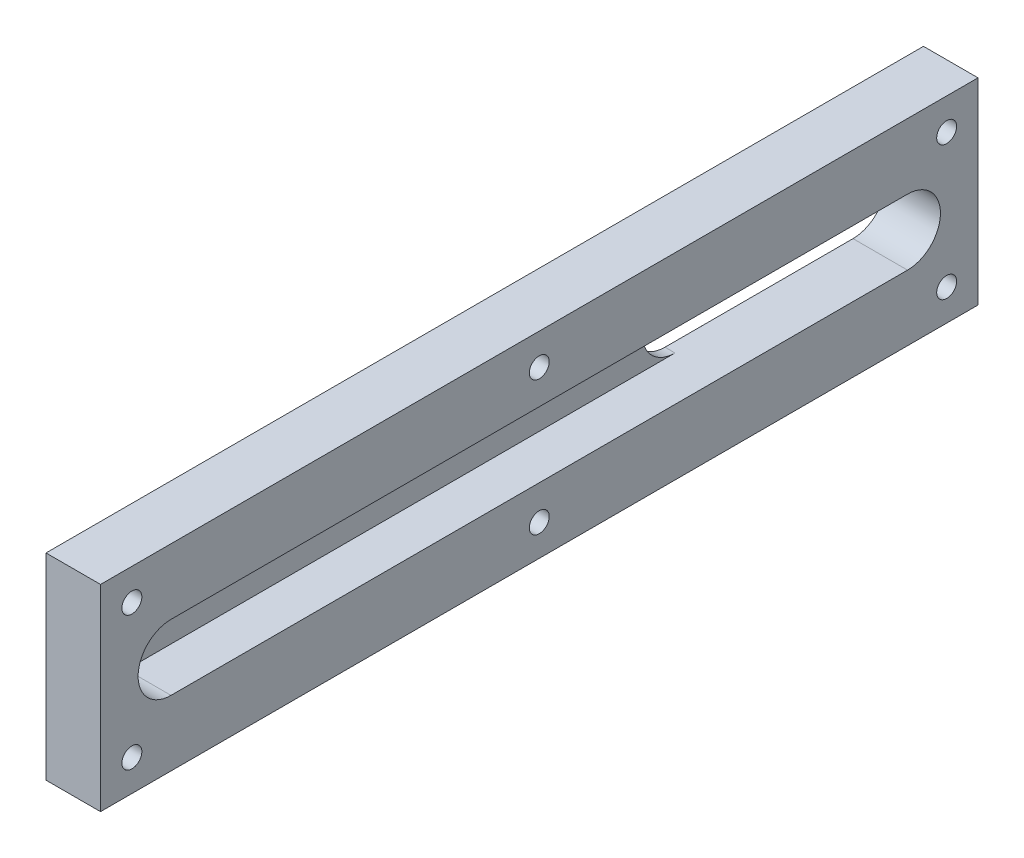
ISO-10303-21;
HEADER;
FILE_DESCRIPTION(('STEP AP214'),'2;1');
FILE_NAME('part.step','',(''),(''),'','','');
FILE_SCHEMA(('AUTOMOTIVE_DESIGN { 1 0 10303 214 1 1 1 1 }'));
ENDSEC;
DATA;
#1=APPLICATION_CONTEXT('core data for automotive mechanical design processes');
#2=APPLICATION_PROTOCOL_DEFINITION('international standard','automotive_design',2000,#1);
#3=PRODUCT_CONTEXT('',#1,'mechanical');
#4=PRODUCT('Part','Part','',(#3));
#5=PRODUCT_RELATED_PRODUCT_CATEGORY('part','',(#4));
#6=PRODUCT_DEFINITION_FORMATION('','',#4);
#7=PRODUCT_DEFINITION_CONTEXT('part definition',#1,'design');
#8=PRODUCT_DEFINITION('design','',#6,#7);
#9=PRODUCT_DEFINITION_SHAPE('','',#8);
#10=(LENGTH_UNIT() NAMED_UNIT(*) SI_UNIT(.MILLI.,.METRE.));
#11=(NAMED_UNIT(*) PLANE_ANGLE_UNIT() SI_UNIT($,.RADIAN.));
#12=(NAMED_UNIT(*) SI_UNIT($,.STERADIAN.) SOLID_ANGLE_UNIT());
#13=UNCERTAINTY_MEASURE_WITH_UNIT(LENGTH_MEASURE(1.E-05),#10,'distance_accuracy_value','');
#14=(GEOMETRIC_REPRESENTATION_CONTEXT(3) GLOBAL_UNCERTAINTY_ASSIGNED_CONTEXT((#13)) GLOBAL_UNIT_ASSIGNED_CONTEXT((#10,
#11,#12)) REPRESENTATION_CONTEXT('',''));
#15=CARTESIAN_POINT('',(0.,0.,0.));
#16=DIRECTION('',(0.,0.,1.));
#17=DIRECTION('',(1.,0.,0.));
#18=AXIS2_PLACEMENT_3D('',#15,#16,#17);
#19=CARTESIAN_POINT('',(11.049,-6.66750000000003,74.621306688));
#20=DIRECTION('',(0.,1.,0.));
#21=DIRECTION('',(0.,0.,1.));
#22=AXIS2_PLACEMENT_3D('',#19,#20,#21);
#23=PLANE('',#22);
#24=DIRECTION('',(0.,0.,-1.));
#25=VECTOR('',#24,1.);
#26=CARTESIAN_POINT('',(0.,-6.66750000000003,74.621306688));
#27=LINE('',#26,#25);
#28=CARTESIAN_POINT('',(0.,-6.6675,-36.521306688));
#29=VERTEX_POINT('',#28);
#30=CARTESIAN_POINT('',(0.,-6.6675,-74.621306688));
#31=VERTEX_POINT('',#30);
#32=EDGE_CURVE('E168',#29,#31,#27,.T.);
#33=ORIENTED_EDGE('',*,*,#32,.F.);
#34=DIRECTION('',(-1.,0.,0.));
#35=VECTOR('',#34,1.);
#36=CARTESIAN_POINT('',(2.032,-6.6675,-36.521306688));
#37=LINE('',#36,#35);
#38=CARTESIAN_POINT('',(2.032,-6.6675,-36.521306688));
#39=VERTEX_POINT('',#38);
#40=EDGE_CURVE('E159',#39,#29,#37,.T.);
#41=ORIENTED_EDGE('',*,*,#40,.F.);
#42=DIRECTION('',(0.,0.,1.));
#43=VECTOR('',#42,1.);
#44=CARTESIAN_POINT('',(2.032,-6.6675,-36.521306688));
#45=LINE('',#44,#43);
#46=CARTESIAN_POINT('',(2.032,-6.66750000000003,74.621306688));
#47=VERTEX_POINT('',#46);
#48=EDGE_CURVE('E144',#39,#47,#45,.T.);
#49=ORIENTED_EDGE('',*,*,#48,.T.);
#50=DIRECTION('',(-1.,0.,0.));
#51=VECTOR('',#50,1.);
#52=CARTESIAN_POINT('',(11.049,-6.66750000000003,74.621306688));
#53=LINE('',#52,#51);
#54=CARTESIAN_POINT('',(11.049,-6.66750000000003,74.621306688));
#55=VERTEX_POINT('',#54);
#56=EDGE_CURVE('E251',#55,#47,#53,.T.);
#57=ORIENTED_EDGE('',*,*,#56,.F.);
#58=DIRECTION('',(0.,0.,-1.));
#59=VECTOR('',#58,1.);
#60=CARTESIAN_POINT('',(11.049,-6.66750000000003,74.621306688));
#61=LINE('',#60,#59);
#62=CARTESIAN_POINT('',(11.049,-6.6675,-74.621306688));
#63=VERTEX_POINT('',#62);
#64=EDGE_CURVE('E226',#55,#63,#61,.T.);
#65=ORIENTED_EDGE('',*,*,#64,.T.);
#66=DIRECTION('',(-1.,0.,0.));
#67=VECTOR('',#66,1.);
#68=CARTESIAN_POINT('',(11.049,-6.6675,-74.621306688));
#69=LINE('',#68,#67);
#70=EDGE_CURVE('E248',#63,#31,#69,.T.);
#71=ORIENTED_EDGE('',*,*,#70,.T.);
#72=EDGE_LOOP('',(#33,#41,#49,#57,#65,#71));
#73=FACE_BOUND('',#72,.T.);
#74=ADVANCED_FACE('F47',(#73),#23,.T.);
#75=CARTESIAN_POINT('',(11.049,0.,0.));
#76=DIRECTION('',(1.,0.,0.));
#77=DIRECTION('',(0.,0.,-1.));
#78=AXIS2_PLACEMENT_3D('',#75,#76,#77);
#79=PLANE('',#78);
#80=CARTESIAN_POINT('',(11.049,13.589,82.55));
#81=DIRECTION('',(1.,0.,0.));
#82=DIRECTION('',(0.,0.,-1.));
#83=AXIS2_PLACEMENT_3D('',#80,#81,#82);
#84=CIRCLE('',#83,2.0193);
#85=CARTESIAN_POINT('',(11.049,13.589,80.5307));
#86=VERTEX_POINT('',#85);
#87=EDGE_CURVE('E174',#86,#86,#84,.T.);
#88=ORIENTED_EDGE('',*,*,#87,.F.);
#89=EDGE_LOOP('',(#88));
#90=FACE_BOUND('',#89,.T.);
#91=CARTESIAN_POINT('',(11.049,-13.589,82.55));
#92=DIRECTION('',(1.,0.,0.));
#93=DIRECTION('',(0.,0.,-1.));
#94=AXIS2_PLACEMENT_3D('',#91,#92,#93);
#95=CIRCLE('',#94,2.0193);
#96=CARTESIAN_POINT('',(11.049,-13.589,80.5307));
#97=VERTEX_POINT('',#96);
#98=EDGE_CURVE('E187',#97,#97,#95,.T.);
#99=ORIENTED_EDGE('',*,*,#98,.F.);
#100=EDGE_LOOP('',(#99));
#101=FACE_BOUND('',#100,.T.);
#102=CARTESIAN_POINT('',(11.049,-13.589,0.));
#103=DIRECTION('',(1.,0.,0.));
#104=DIRECTION('',(0.,0.,-1.));
#105=AXIS2_PLACEMENT_3D('',#102,#103,#104);
#106=CIRCLE('',#105,2.0193);
#107=CARTESIAN_POINT('',(11.049,-13.589,-2.0193));
#108=VERTEX_POINT('',#107);
#109=EDGE_CURVE('E193',#108,#108,#106,.T.);
#110=ORIENTED_EDGE('',*,*,#109,.F.);
#111=EDGE_LOOP('',(#110));
#112=FACE_BOUND('',#111,.T.);
#113=CARTESIAN_POINT('',(11.049,-13.589,-82.55));
#114=DIRECTION('',(1.,0.,0.));
#115=DIRECTION('',(0.,0.,-1.));
#116=AXIS2_PLACEMENT_3D('',#113,#114,#115);
#117=CIRCLE('',#116,2.0193);
#118=CARTESIAN_POINT('',(11.049,-13.589,-84.5693));
#119=VERTEX_POINT('',#118);
#120=EDGE_CURVE('E201',#119,#119,#117,.T.);
#121=ORIENTED_EDGE('',*,*,#120,.F.);
#122=EDGE_LOOP('',(#121));
#123=FACE_BOUND('',#122,.T.);
#124=CARTESIAN_POINT('',(11.049,13.589,-82.55));
#125=DIRECTION('',(1.,0.,0.));
#126=DIRECTION('',(0.,0.,-1.));
#127=AXIS2_PLACEMENT_3D('',#124,#125,#126);
#128=CIRCLE('',#127,2.0193);
#129=CARTESIAN_POINT('',(11.049,13.589,-84.5693));
#130=VERTEX_POINT('',#129);
#131=EDGE_CURVE('E208',#130,#130,#128,.T.);
#132=ORIENTED_EDGE('',*,*,#131,.F.);
#133=EDGE_LOOP('',(#132));
#134=FACE_BOUND('',#133,.T.);
#135=CARTESIAN_POINT('',(11.049,13.589,0.));
#136=DIRECTION('',(1.,0.,0.));
#137=DIRECTION('',(0.,0.,-1.));
#138=AXIS2_PLACEMENT_3D('',#135,#136,#137);
#139=CIRCLE('',#138,2.0193);
#140=CARTESIAN_POINT('',(11.049,13.589,-2.0193));
#141=VERTEX_POINT('',#140);
#142=EDGE_CURVE('E215',#141,#141,#139,.T.);
#143=ORIENTED_EDGE('',*,*,#142,.F.);
#144=EDGE_LOOP('',(#143));
#145=FACE_BOUND('',#144,.T.);
#146=DIRECTION('',(0.,-1.,0.));
#147=VECTOR('',#146,1.);
#148=CARTESIAN_POINT('',(11.049,-19.939,88.9));
#149=LINE('',#148,#147);
#150=CARTESIAN_POINT('',(11.049,19.939,88.9));
#151=VERTEX_POINT('',#150);
#152=CARTESIAN_POINT('',(11.049,-19.939,88.9));
#153=VERTEX_POINT('',#152);
#154=EDGE_CURVE('E255',#151,#153,#149,.T.);
#155=ORIENTED_EDGE('',*,*,#154,.T.);
#156=DIRECTION('',(0.,0.,-1.));
#157=VECTOR('',#156,1.);
#158=CARTESIAN_POINT('',(11.049,-19.939,-88.9));
#159=LINE('',#158,#157);
#160=CARTESIAN_POINT('',(11.049,-19.939,-88.9));
#161=VERTEX_POINT('',#160);
#162=EDGE_CURVE('E106',#153,#161,#159,.T.);
#163=ORIENTED_EDGE('',*,*,#162,.T.);
#164=DIRECTION('',(0.,1.,0.));
#165=VECTOR('',#164,1.);
#166=CARTESIAN_POINT('',(11.049,-19.939,-88.9));
#167=LINE('',#166,#165);
#168=CARTESIAN_POINT('',(11.049,19.939,-88.9));
#169=VERTEX_POINT('',#168);
#170=EDGE_CURVE('E260',#161,#169,#167,.T.);
#171=ORIENTED_EDGE('',*,*,#170,.T.);
#172=DIRECTION('',(0.,0.,1.));
#173=VECTOR('',#172,1.);
#174=CARTESIAN_POINT('',(11.049,19.939,-88.9));
#175=LINE('',#174,#173);
#176=EDGE_CURVE('E77',#169,#151,#175,.T.);
#177=ORIENTED_EDGE('',*,*,#176,.T.);
#178=EDGE_LOOP('',(#155,#163,#171,#177));
#179=FACE_BOUND('',#178,.T.);
#180=ORIENTED_EDGE('',*,*,#64,.F.);
#181=CARTESIAN_POINT('',(11.049,0.,74.621306688));
#182=DIRECTION('',(1.,0.,0.));
#183=DIRECTION('',(0.,0.,-1.));
#184=AXIS2_PLACEMENT_3D('',#181,#182,#183);
#185=CIRCLE('',#184,6.66750000000003);
#186=CARTESIAN_POINT('',(11.049,6.66750000000003,74.621306688));
#187=VERTEX_POINT('',#186);
#188=EDGE_CURVE('E223',#187,#55,#185,.T.);
#189=ORIENTED_EDGE('',*,*,#188,.F.);
#190=DIRECTION('',(0.,0.,1.));
#191=VECTOR('',#190,1.);
#192=CARTESIAN_POINT('',(11.049,6.66750000000003,74.621306688));
#193=LINE('',#192,#191);
#194=CARTESIAN_POINT('',(11.049,6.66750000000006,-74.621306688));
#195=VERTEX_POINT('',#194);
#196=EDGE_CURVE('E233',#195,#187,#193,.T.);
#197=ORIENTED_EDGE('',*,*,#196,.F.);
#198=CARTESIAN_POINT('',(11.049,0.,-74.621306688));
#199=DIRECTION('',(1.,0.,0.));
#200=DIRECTION('',(0.,0.,-1.));
#201=AXIS2_PLACEMENT_3D('',#198,#199,#200);
#202=CIRCLE('',#201,6.66750000000003);
#203=EDGE_CURVE('E230',#63,#195,#202,.T.);
#204=ORIENTED_EDGE('',*,*,#203,.F.);
#205=EDGE_LOOP('',(#180,#189,#197,#204));
#206=FACE_BOUND('',#205,.T.);
#207=ADVANCED_FACE('F307',(#90,#101,#112,#123,#134,#145,#179,#206),#79,.T.);
#208=CARTESIAN_POINT('',(0.,0.,0.));
#209=DIRECTION('',(1.,0.,0.));
#210=DIRECTION('',(0.,0.,-1.));
#211=AXIS2_PLACEMENT_3D('',#208,#209,#210);
#212=PLANE('',#211);
#213=CARTESIAN_POINT('',(0.,0.,-36.521306688));
#214=DIRECTION('',(1.,0.,0.));
#215=DIRECTION('',(0.,0.,-1.));
#216=AXIS2_PLACEMENT_3D('',#213,#214,#215);
#217=CIRCLE('',#216,6.66750000000003);
#218=CARTESIAN_POINT('',(0.,6.66750000000005,-36.521306688));
#219=VERTEX_POINT('',#218);
#220=EDGE_CURVE('E164',#219,#29,#217,.T.);
#221=ORIENTED_EDGE('',*,*,#220,.T.);
#222=ORIENTED_EDGE('',*,*,#32,.T.);
#223=CARTESIAN_POINT('',(0.,0.,-74.621306688));
#224=DIRECTION('',(1.,0.,0.));
#225=DIRECTION('',(0.,0.,-1.));
#226=AXIS2_PLACEMENT_3D('',#223,#224,#225);
#227=CIRCLE('',#226,6.66750000000003);
#228=CARTESIAN_POINT('',(0.,6.66750000000006,-74.621306688));
#229=VERTEX_POINT('',#228);
#230=EDGE_CURVE('E238',#31,#229,#227,.T.);
#231=ORIENTED_EDGE('',*,*,#230,.T.);
#232=DIRECTION('',(0.,0.,1.));
#233=VECTOR('',#232,1.);
#234=CARTESIAN_POINT('',(0.,6.66750000000003,74.621306688));
#235=LINE('',#234,#233);
#236=EDGE_CURVE('E227',#229,#219,#235,.T.);
#237=ORIENTED_EDGE('',*,*,#236,.T.);
#238=EDGE_LOOP('',(#221,#222,#231,#237));
#239=FACE_BOUND('',#238,.T.);
#240=CARTESIAN_POINT('',(0.,13.589,82.55));
#241=DIRECTION('',(1.,0.,0.));
#242=DIRECTION('',(0.,0.,-1.));
#243=AXIS2_PLACEMENT_3D('',#240,#241,#242);
#244=CIRCLE('',#243,2.0193);
#245=CARTESIAN_POINT('',(0.,13.589,80.5307));
#246=VERTEX_POINT('',#245);
#247=EDGE_CURVE('E183',#246,#246,#244,.T.);
#248=ORIENTED_EDGE('',*,*,#247,.T.);
#249=EDGE_LOOP('',(#248));
#250=FACE_BOUND('',#249,.T.);
#251=CARTESIAN_POINT('',(0.,-13.589,82.55));
#252=DIRECTION('',(1.,0.,0.));
#253=DIRECTION('',(0.,0.,-1.));
#254=AXIS2_PLACEMENT_3D('',#251,#252,#253);
#255=CIRCLE('',#254,2.0193);
#256=CARTESIAN_POINT('',(0.,-13.589,80.5307));
#257=VERTEX_POINT('',#256);
#258=EDGE_CURVE('E190',#257,#257,#255,.T.);
#259=ORIENTED_EDGE('',*,*,#258,.T.);
#260=EDGE_LOOP('',(#259));
#261=FACE_BOUND('',#260,.T.);
#262=CARTESIAN_POINT('',(0.,-13.589,0.));
#263=DIRECTION('',(1.,0.,0.));
#264=DIRECTION('',(0.,0.,-1.));
#265=AXIS2_PLACEMENT_3D('',#262,#263,#264);
#266=CIRCLE('',#265,2.0193);
#267=CARTESIAN_POINT('',(0.,-13.589,-2.0193));
#268=VERTEX_POINT('',#267);
#269=EDGE_CURVE('E197',#268,#268,#266,.T.);
#270=ORIENTED_EDGE('',*,*,#269,.T.);
#271=EDGE_LOOP('',(#270));
#272=FACE_BOUND('',#271,.T.);
#273=CARTESIAN_POINT('',(0.,-13.589,-82.55));
#274=DIRECTION('',(1.,0.,0.));
#275=DIRECTION('',(0.,0.,-1.));
#276=AXIS2_PLACEMENT_3D('',#273,#274,#275);
#277=CIRCLE('',#276,2.0193);
#278=CARTESIAN_POINT('',(0.,-13.589,-84.5693));
#279=VERTEX_POINT('',#278);
#280=EDGE_CURVE('E205',#279,#279,#277,.T.);
#281=ORIENTED_EDGE('',*,*,#280,.T.);
#282=EDGE_LOOP('',(#281));
#283=FACE_BOUND('',#282,.T.);
#284=CARTESIAN_POINT('',(0.,13.589,-82.55));
#285=DIRECTION('',(1.,0.,0.));
#286=DIRECTION('',(0.,0.,-1.));
#287=AXIS2_PLACEMENT_3D('',#284,#285,#286);
#288=CIRCLE('',#287,2.0193);
#289=CARTESIAN_POINT('',(0.,13.589,-84.5693));
#290=VERTEX_POINT('',#289);
#291=EDGE_CURVE('E212',#290,#290,#288,.T.);
#292=ORIENTED_EDGE('',*,*,#291,.T.);
#293=EDGE_LOOP('',(#292));
#294=FACE_BOUND('',#293,.T.);
#295=CARTESIAN_POINT('',(0.,13.589,0.));
#296=DIRECTION('',(1.,0.,0.));
#297=DIRECTION('',(0.,0.,-1.));
#298=AXIS2_PLACEMENT_3D('',#295,#296,#297);
#299=CIRCLE('',#298,2.0193);
#300=CARTESIAN_POINT('',(0.,13.589,-2.0193));
#301=VERTEX_POINT('',#300);
#302=EDGE_CURVE('E219',#301,#301,#299,.T.);
#303=ORIENTED_EDGE('',*,*,#302,.T.);
#304=EDGE_LOOP('',(#303));
#305=FACE_BOUND('',#304,.T.);
#306=DIRECTION('',(0.,-1.,0.));
#307=VECTOR('',#306,1.);
#308=CARTESIAN_POINT('',(0.,-19.939,88.9));
#309=LINE('',#308,#307);
#310=CARTESIAN_POINT('',(0.,19.939,88.9));
#311=VERTEX_POINT('',#310);
#312=CARTESIAN_POINT('',(0.,-19.939,88.9));
#313=VERTEX_POINT('',#312);
#314=EDGE_CURVE('E254',#311,#313,#309,.T.);
#315=ORIENTED_EDGE('',*,*,#314,.F.);
#316=DIRECTION('',(0.,0.,1.));
#317=VECTOR('',#316,1.);
#318=CARTESIAN_POINT('',(0.,19.939,-88.9));
#319=LINE('',#318,#317);
#320=CARTESIAN_POINT('',(0.,19.939,-88.9));
#321=VERTEX_POINT('',#320);
#322=EDGE_CURVE('E99',#321,#311,#319,.T.);
#323=ORIENTED_EDGE('',*,*,#322,.F.);
#324=DIRECTION('',(0.,1.,0.));
#325=VECTOR('',#324,1.);
#326=CARTESIAN_POINT('',(0.,-19.939,-88.9));
#327=LINE('',#326,#325);
#328=CARTESIAN_POINT('',(0.,-19.939,-88.9));
#329=VERTEX_POINT('',#328);
#330=EDGE_CURVE('E272',#329,#321,#327,.T.);
#331=ORIENTED_EDGE('',*,*,#330,.F.);
#332=DIRECTION('',(0.,0.,-1.));
#333=VECTOR('',#332,1.);
#334=CARTESIAN_POINT('',(0.,-19.939,-88.9));
#335=LINE('',#334,#333);
#336=EDGE_CURVE('E269',#313,#329,#335,.T.);
#337=ORIENTED_EDGE('',*,*,#336,.F.);
#338=EDGE_LOOP('',(#315,#323,#331,#337));
#339=FACE_BOUND('',#338,.T.);
#340=ADVANCED_FACE('F288',(#239,#250,#261,#272,#283,#294,#305,#339),#212,.F.);
#341=CARTESIAN_POINT('',(11.049,-19.939,88.9));
#342=DIRECTION('',(0.,0.,-1.));
#343=DIRECTION('',(-1.,0.,0.));
#344=AXIS2_PLACEMENT_3D('',#341,#342,#343);
#345=PLANE('',#344);
#346=ORIENTED_EDGE('',*,*,#314,.T.);
#347=DIRECTION('',(-1.,0.,0.));
#348=VECTOR('',#347,1.);
#349=CARTESIAN_POINT('',(11.049,-19.939,88.9));
#350=LINE('',#349,#348);
#351=EDGE_CURVE('E11',#153,#313,#350,.T.);
#352=ORIENTED_EDGE('',*,*,#351,.F.);
#353=ORIENTED_EDGE('',*,*,#154,.F.);
#354=DIRECTION('',(-1.,0.,0.));
#355=VECTOR('',#354,1.);
#356=CARTESIAN_POINT('',(11.049,19.939,88.9));
#357=LINE('',#356,#355);
#358=EDGE_CURVE('E265',#151,#311,#357,.T.);
#359=ORIENTED_EDGE('',*,*,#358,.T.);
#360=EDGE_LOOP('',(#346,#352,#353,#359));
#361=FACE_BOUND('',#360,.T.);
#362=ADVANCED_FACE('F49',(#361),#345,.F.);
#363=CARTESIAN_POINT('',(11.049,-19.939,-88.9));
#364=DIRECTION('',(0.,1.,0.));
#365=DIRECTION('',(0.,0.,1.));
#366=AXIS2_PLACEMENT_3D('',#363,#364,#365);
#367=PLANE('',#366);
#368=ORIENTED_EDGE('',*,*,#336,.T.);
#369=DIRECTION('',(-1.,0.,0.));
#370=VECTOR('',#369,1.);
#371=CARTESIAN_POINT('',(11.049,-19.939,-88.9));
#372=LINE('',#371,#370);
#373=EDGE_CURVE('E55',#161,#329,#372,.T.);
#374=ORIENTED_EDGE('',*,*,#373,.F.);
#375=ORIENTED_EDGE('',*,*,#162,.F.);
#376=ORIENTED_EDGE('',*,*,#351,.T.);
#377=EDGE_LOOP('',(#368,#374,#375,#376));
#378=FACE_BOUND('',#377,.T.);
#379=ADVANCED_FACE('F303',(#378),#367,.F.);
#380=CARTESIAN_POINT('',(11.049,-19.939,-88.9));
#381=DIRECTION('',(0.,0.,1.));
#382=DIRECTION('',(1.,0.,0.));
#383=AXIS2_PLACEMENT_3D('',#380,#381,#382);
#384=PLANE('',#383);
#385=ORIENTED_EDGE('',*,*,#330,.T.);
#386=DIRECTION('',(-1.,0.,0.));
#387=VECTOR('',#386,1.);
#388=CARTESIAN_POINT('',(11.049,19.939,-88.9));
#389=LINE('',#388,#387);
#390=EDGE_CURVE('E278',#169,#321,#389,.T.);
#391=ORIENTED_EDGE('',*,*,#390,.F.);
#392=ORIENTED_EDGE('',*,*,#170,.F.);
#393=ORIENTED_EDGE('',*,*,#373,.T.);
#394=EDGE_LOOP('',(#385,#391,#392,#393));
#395=FACE_BOUND('',#394,.T.);
#396=ADVANCED_FACE('F284',(#395),#384,.F.);
#397=CARTESIAN_POINT('',(11.049,19.939,-88.9));
#398=DIRECTION('',(0.,-1.,0.));
#399=DIRECTION('',(0.,0.,-1.));
#400=AXIS2_PLACEMENT_3D('',#397,#398,#399);
#401=PLANE('',#400);
#402=ORIENTED_EDGE('',*,*,#322,.T.);
#403=ORIENTED_EDGE('',*,*,#358,.F.);
#404=ORIENTED_EDGE('',*,*,#176,.F.);
#405=ORIENTED_EDGE('',*,*,#390,.T.);
#406=EDGE_LOOP('',(#402,#403,#404,#405));
#407=FACE_BOUND('',#406,.T.);
#408=ADVANCED_FACE('F292',(#407),#401,.F.);
#409=CARTESIAN_POINT('',(11.049,0.,74.621306688));
#410=DIRECTION('',(-1.,0.,0.));
#411=DIRECTION('',(0.,0.,1.));
#412=AXIS2_PLACEMENT_3D('',#409,#410,#411);
#413=CYLINDRICAL_SURFACE('',#412,6.66750000000003);
#414=CARTESIAN_POINT('',(2.032,0.,74.621306688));
#415=DIRECTION('',(-1.,0.,0.));
#416=DIRECTION('',(0.,0.,1.));
#417=AXIS2_PLACEMENT_3D('',#414,#415,#416);
#418=CIRCLE('',#417,6.66750000000003);
#419=CARTESIAN_POINT('',(2.032,6.66750000000003,74.621306688));
#420=VERTEX_POINT('',#419);
#421=EDGE_CURVE('E150',#47,#420,#418,.T.);
#422=ORIENTED_EDGE('',*,*,#421,.T.);
#423=DIRECTION('',(-1.,0.,0.));
#424=VECTOR('',#423,1.);
#425=CARTESIAN_POINT('',(11.049,6.66750000000003,74.621306688));
#426=LINE('',#425,#424);
#427=EDGE_CURVE('E236',#187,#420,#426,.T.);
#428=ORIENTED_EDGE('',*,*,#427,.F.);
#429=ORIENTED_EDGE('',*,*,#188,.T.);
#430=ORIENTED_EDGE('',*,*,#56,.T.);
#431=EDGE_LOOP('',(#422,#428,#429,#430));
#432=FACE_BOUND('',#431,.T.);
#433=ADVANCED_FACE('F294',(#432),#413,.F.);
#434=CARTESIAN_POINT('',(11.049,0.,-74.621306688));
#435=DIRECTION('',(-1.,0.,0.));
#436=DIRECTION('',(0.,0.,1.));
#437=AXIS2_PLACEMENT_3D('',#434,#435,#436);
#438=CYLINDRICAL_SURFACE('',#437,6.66750000000003);
#439=ORIENTED_EDGE('',*,*,#230,.F.);
#440=ORIENTED_EDGE('',*,*,#70,.F.);
#441=ORIENTED_EDGE('',*,*,#203,.T.);
#442=DIRECTION('',(-1.,0.,0.));
#443=VECTOR('',#442,1.);
#444=CARTESIAN_POINT('',(11.049,6.66750000000006,-74.621306688));
#445=LINE('',#444,#443);
#446=EDGE_CURVE('E65',#195,#229,#445,.T.);
#447=ORIENTED_EDGE('',*,*,#446,.T.);
#448=EDGE_LOOP('',(#439,#440,#441,#447));
#449=FACE_BOUND('',#448,.T.);
#450=ADVANCED_FACE('F300',(#449),#438,.F.);
#451=CARTESIAN_POINT('',(11.049,6.66750000000003,74.621306688));
#452=DIRECTION('',(0.,-1.,0.));
#453=DIRECTION('',(0.,0.,-1.));
#454=AXIS2_PLACEMENT_3D('',#451,#452,#453);
#455=PLANE('',#454);
#456=DIRECTION('',(-1.,0.,0.));
#457=VECTOR('',#456,1.);
#458=CARTESIAN_POINT('',(2.032,6.66750000000005,-36.521306688));
#459=LINE('',#458,#457);
#460=CARTESIAN_POINT('',(2.032,6.66750000000005,-36.521306688));
#461=VERTEX_POINT('',#460);
#462=EDGE_CURVE('E162',#461,#219,#459,.T.);
#463=ORIENTED_EDGE('',*,*,#462,.T.);
#464=ORIENTED_EDGE('',*,*,#236,.F.);
#465=ORIENTED_EDGE('',*,*,#446,.F.);
#466=ORIENTED_EDGE('',*,*,#196,.T.);
#467=ORIENTED_EDGE('',*,*,#427,.T.);
#468=DIRECTION('',(0.,0.,-1.));
#469=VECTOR('',#468,1.);
#470=CARTESIAN_POINT('',(2.032,6.66750000000003,74.621306688));
#471=LINE('',#470,#469);
#472=EDGE_CURVE('E170',#420,#461,#471,.T.);
#473=ORIENTED_EDGE('',*,*,#472,.T.);
#474=EDGE_LOOP('',(#463,#464,#465,#466,#467,#473));
#475=FACE_BOUND('',#474,.T.);
#476=ADVANCED_FACE('F338',(#475),#455,.T.);
#477=CARTESIAN_POINT('',(11.049,13.589,0.));
#478=DIRECTION('',(1.,0.,0.));
#479=DIRECTION('',(0.,0.,-1.));
#480=AXIS2_PLACEMENT_3D('',#477,#478,#479);
#481=CYLINDRICAL_SURFACE('',#480,2.0193);
#482=ORIENTED_EDGE('',*,*,#302,.F.);
#483=EDGE_LOOP('',(#482));
#484=FACE_BOUND('',#483,.T.);
#485=ORIENTED_EDGE('',*,*,#142,.T.);
#486=EDGE_LOOP('',(#485));
#487=FACE_BOUND('',#486,.T.);
#488=ADVANCED_FACE('F334',(#484,#487),#481,.F.);
#489=CARTESIAN_POINT('',(11.049,13.589,-82.55));
#490=DIRECTION('',(1.,0.,0.));
#491=DIRECTION('',(0.,0.,-1.));
#492=AXIS2_PLACEMENT_3D('',#489,#490,#491);
#493=CYLINDRICAL_SURFACE('',#492,2.0193);
#494=ORIENTED_EDGE('',*,*,#291,.F.);
#495=EDGE_LOOP('',(#494));
#496=FACE_BOUND('',#495,.T.);
#497=ORIENTED_EDGE('',*,*,#131,.T.);
#498=EDGE_LOOP('',(#497));
#499=FACE_BOUND('',#498,.T.);
#500=ADVANCED_FACE('F337',(#496,#499),#493,.F.);
#501=CARTESIAN_POINT('',(11.049,-13.589,-82.55));
#502=DIRECTION('',(1.,0.,0.));
#503=DIRECTION('',(0.,0.,-1.));
#504=AXIS2_PLACEMENT_3D('',#501,#502,#503);
#505=CYLINDRICAL_SURFACE('',#504,2.0193);
#506=ORIENTED_EDGE('',*,*,#280,.F.);
#507=EDGE_LOOP('',(#506));
#508=FACE_BOUND('',#507,.T.);
#509=ORIENTED_EDGE('',*,*,#120,.T.);
#510=EDGE_LOOP('',(#509));
#511=FACE_BOUND('',#510,.T.);
#512=ADVANCED_FACE('F361',(#508,#511),#505,.F.);
#513=CARTESIAN_POINT('',(11.049,-13.589,0.));
#514=DIRECTION('',(1.,0.,0.));
#515=DIRECTION('',(0.,0.,-1.));
#516=AXIS2_PLACEMENT_3D('',#513,#514,#515);
#517=CYLINDRICAL_SURFACE('',#516,2.0193);
#518=ORIENTED_EDGE('',*,*,#269,.F.);
#519=EDGE_LOOP('',(#518));
#520=FACE_BOUND('',#519,.T.);
#521=ORIENTED_EDGE('',*,*,#109,.T.);
#522=EDGE_LOOP('',(#521));
#523=FACE_BOUND('',#522,.T.);
#524=ADVANCED_FACE('F365',(#520,#523),#517,.F.);
#525=CARTESIAN_POINT('',(11.049,-13.589,82.55));
#526=DIRECTION('',(1.,0.,0.));
#527=DIRECTION('',(0.,0.,-1.));
#528=AXIS2_PLACEMENT_3D('',#525,#526,#527);
#529=CYLINDRICAL_SURFACE('',#528,2.0193);
#530=ORIENTED_EDGE('',*,*,#258,.F.);
#531=EDGE_LOOP('',(#530));
#532=FACE_BOUND('',#531,.T.);
#533=ORIENTED_EDGE('',*,*,#98,.T.);
#534=EDGE_LOOP('',(#533));
#535=FACE_BOUND('',#534,.T.);
#536=ADVANCED_FACE('F369',(#532,#535),#529,.F.);
#537=CARTESIAN_POINT('',(11.049,13.589,82.55));
#538=DIRECTION('',(1.,0.,0.));
#539=DIRECTION('',(0.,0.,-1.));
#540=AXIS2_PLACEMENT_3D('',#537,#538,#539);
#541=CYLINDRICAL_SURFACE('',#540,2.0193);
#542=ORIENTED_EDGE('',*,*,#247,.F.);
#543=EDGE_LOOP('',(#542));
#544=FACE_BOUND('',#543,.T.);
#545=ORIENTED_EDGE('',*,*,#87,.T.);
#546=EDGE_LOOP('',(#545));
#547=FACE_BOUND('',#546,.T.);
#548=ADVANCED_FACE('F373',(#544,#547),#541,.F.);
#549=CARTESIAN_POINT('',(2.032,0.,-36.521306688));
#550=DIRECTION('',(-1.,0.,0.));
#551=DIRECTION('',(0.,0.,1.));
#552=AXIS2_PLACEMENT_3D('',#549,#550,#551);
#553=CYLINDRICAL_SURFACE('',#552,6.66750000000003);
#554=ORIENTED_EDGE('',*,*,#220,.F.);
#555=ORIENTED_EDGE('',*,*,#462,.F.);
#556=CARTESIAN_POINT('',(2.032,0.,-36.521306688));
#557=DIRECTION('',(1.,0.,0.));
#558=DIRECTION('',(0.,0.,-1.));
#559=AXIS2_PLACEMENT_3D('',#556,#557,#558);
#560=CIRCLE('',#559,6.66750000000003);
#561=EDGE_CURVE('E147',#461,#39,#560,.T.);
#562=ORIENTED_EDGE('',*,*,#561,.T.);
#563=ORIENTED_EDGE('',*,*,#40,.T.);
#564=EDGE_LOOP('',(#554,#555,#562,#563));
#565=FACE_BOUND('',#564,.T.);
#566=ADVANCED_FACE('F158',(#565),#553,.F.);
#567=CARTESIAN_POINT('',(2.032,0.,-36.521306688));
#568=DIRECTION('',(1.,0.,0.));
#569=DIRECTION('',(0.,0.,-1.));
#570=AXIS2_PLACEMENT_3D('',#567,#568,#569);
#571=PLANE('',#570);
#572=ORIENTED_EDGE('',*,*,#561,.F.);
#573=ORIENTED_EDGE('',*,*,#472,.F.);
#574=ORIENTED_EDGE('',*,*,#421,.F.);
#575=ORIENTED_EDGE('',*,*,#48,.F.);
#576=EDGE_LOOP('',(#572,#573,#574,#575));
#577=FACE_BOUND('',#576,.T.);
#578=ADVANCED_FACE('F146',(#577),#571,.T.);
#579=CLOSED_SHELL('',(#74,#207,#340,#362,#379,#396,#408,#433,#450,#476,#488,#500,#512,#524,#536,
#548,#566,#578));
#580=MANIFOLD_SOLID_BREP('B2',#579);
#581=ADVANCED_BREP_SHAPE_REPRESENTATION('',(#18,#580),#14);
#582=SHAPE_DEFINITION_REPRESENTATION(#9,#581);
ENDSEC;
END-ISO-10303-21;
